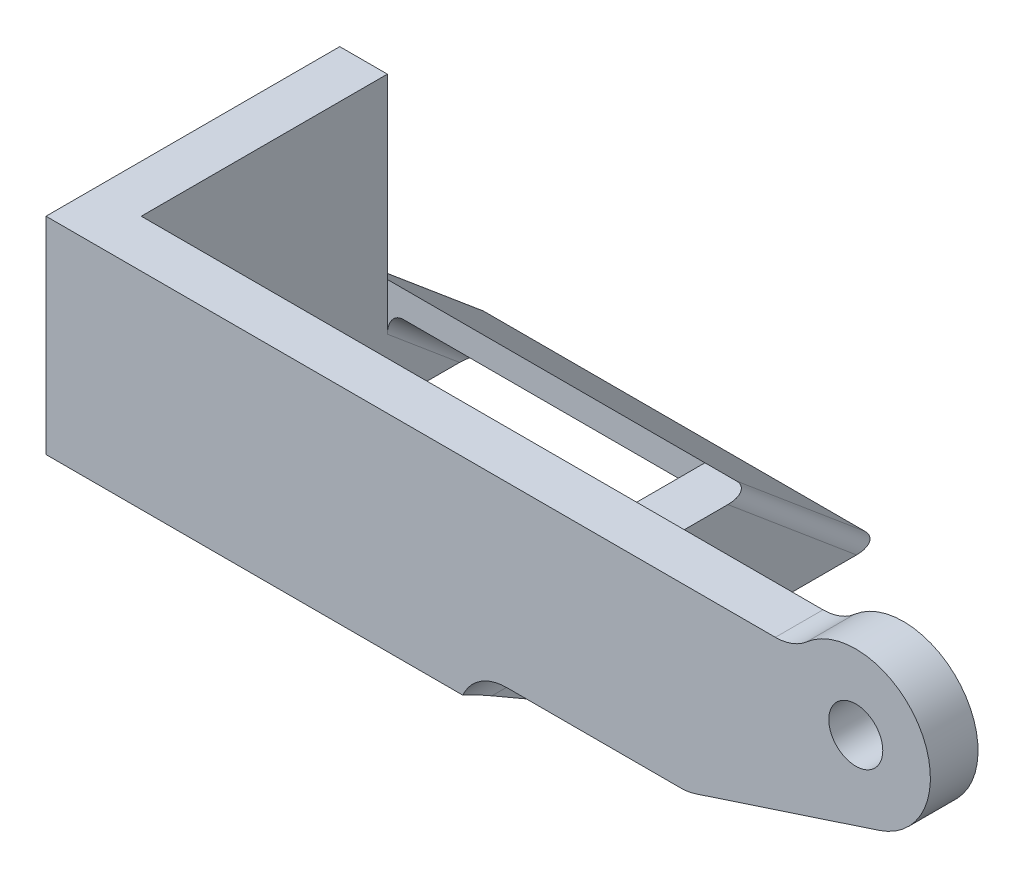
ISO-10303-21;
HEADER;
FILE_DESCRIPTION(('STEP AP214'),'2;1');
FILE_NAME('part.step','',(''),(''),'','','');
FILE_SCHEMA(('AUTOMOTIVE_DESIGN { 1 0 10303 214 1 1 1 1 }'));
ENDSEC;
DATA;
#1=APPLICATION_CONTEXT('core data for automotive mechanical design processes');
#2=APPLICATION_PROTOCOL_DEFINITION('international standard','automotive_design',2000,#1);
#3=PRODUCT_CONTEXT('',#1,'mechanical');
#4=PRODUCT('Part','Part','',(#3));
#5=PRODUCT_RELATED_PRODUCT_CATEGORY('part','',(#4));
#6=PRODUCT_DEFINITION_FORMATION('','',#4);
#7=PRODUCT_DEFINITION_CONTEXT('part definition',#1,'design');
#8=PRODUCT_DEFINITION('design','',#6,#7);
#9=PRODUCT_DEFINITION_SHAPE('','',#8);
#10=(LENGTH_UNIT() NAMED_UNIT(*) SI_UNIT(.MILLI.,.METRE.));
#11=(NAMED_UNIT(*) PLANE_ANGLE_UNIT() SI_UNIT($,.RADIAN.));
#12=(NAMED_UNIT(*) SI_UNIT($,.STERADIAN.) SOLID_ANGLE_UNIT());
#13=UNCERTAINTY_MEASURE_WITH_UNIT(LENGTH_MEASURE(1.E-05),#10,'distance_accuracy_value','');
#14=(GEOMETRIC_REPRESENTATION_CONTEXT(3) GLOBAL_UNCERTAINTY_ASSIGNED_CONTEXT((#13)) GLOBAL_UNIT_ASSIGNED_CONTEXT((#10,
#11,#12)) REPRESENTATION_CONTEXT('',''));
#15=CARTESIAN_POINT('',(0.,0.,0.));
#16=DIRECTION('',(0.,0.,1.));
#17=DIRECTION('',(1.,0.,0.));
#18=AXIS2_PLACEMENT_3D('',#15,#16,#17);
#19=CARTESIAN_POINT('',(-51.,-15.2,-15.5));
#20=DIRECTION('',(0.,0.,1.));
#21=DIRECTION('',(1.,0.,0.));
#22=AXIS2_PLACEMENT_3D('',#19,#20,#21);
#23=PLANE('',#22);
#24=DIRECTION('',(0.,-1.,0.));
#25=VECTOR('',#24,1.);
#26=CARTESIAN_POINT('',(-48.,-15.2,-15.5));
#27=LINE('',#26,#25);
#28=CARTESIAN_POINT('',(-48.,2.79999999999999,-15.5));
#29=VERTEX_POINT('',#28);
#30=CARTESIAN_POINT('',(-48.,-8.4,-15.5));
#31=VERTEX_POINT('',#30);
#32=EDGE_CURVE('E237',#29,#31,#27,.T.);
#33=ORIENTED_EDGE('',*,*,#32,.T.);
#34=DIRECTION('',(1.,0.,0.));
#35=VECTOR('',#34,1.);
#36=CARTESIAN_POINT('',(-61.5789220226508,-8.4,-15.5));
#37=LINE('',#36,#35);
#38=CARTESIAN_POINT('',(-50.,-8.4,-15.5));
#39=VERTEX_POINT('',#38);
#40=EDGE_CURVE('E209',#39,#31,#37,.T.);
#41=ORIENTED_EDGE('',*,*,#40,.F.);
#42=CARTESIAN_POINT('',(-50.,-9.70540728933228,-15.5));
#43=DIRECTION('',(0.,0.,1.));
#44=DIRECTION('',(0.,1.,0.));
#45=AXIS2_PLACEMENT_3D('',#42,#43,#44);
#46=ELLIPSE('',#45,1.30540728933228,1.);
#47=CARTESIAN_POINT('',(-51.,-9.70540728933229,-15.5));
#48=VERTEX_POINT('',#47);
#49=EDGE_CURVE('E371',#39,#48,#46,.T.);
#50=ORIENTED_EDGE('',*,*,#49,.T.);
#51=DIRECTION('',(0.,-1.,0.));
#52=VECTOR('',#51,1.);
#53=CARTESIAN_POINT('',(-51.,-15.2,-15.5));
#54=LINE('',#53,#52);
#55=CARTESIAN_POINT('',(-51.,2.79999999999999,-15.5));
#56=VERTEX_POINT('',#55);
#57=EDGE_CURVE('E264',#56,#48,#54,.T.);
#58=ORIENTED_EDGE('',*,*,#57,.F.);
#59=DIRECTION('',(1.,0.,0.));
#60=VECTOR('',#59,1.);
#61=CARTESIAN_POINT('',(-51.,2.79999999999999,-15.5));
#62=LINE('',#61,#60);
#63=EDGE_CURVE('E245',#56,#29,#62,.T.);
#64=ORIENTED_EDGE('',*,*,#63,.T.);
#65=EDGE_LOOP('',(#33,#41,#50,#58,#64));
#66=FACE_BOUND('',#65,.T.);
#67=ADVANCED_FACE('F35',(#66),#23,.F.);
#68=CARTESIAN_POINT('',(-28.,-8.4,3.));
#69=DIRECTION('',(0.,1.,0.));
#70=DIRECTION('',(0.,0.,1.));
#71=AXIS2_PLACEMENT_3D('',#68,#69,#70);
#72=PLANE('',#71);
#73=DIRECTION('',(1.,0.,0.));
#74=VECTOR('',#73,1.);
#75=CARTESIAN_POINT('',(-28.,-8.4,0.));
#76=LINE('',#75,#74);
#77=CARTESIAN_POINT('',(-22.,-8.4,0.));
#78=VERTEX_POINT('',#77);
#79=CARTESIAN_POINT('',(-11.0286410728593,-8.4,0.));
#80=VERTEX_POINT('',#79);
#81=EDGE_CURVE('E539',#78,#80,#76,.T.);
#82=ORIENTED_EDGE('',*,*,#81,.T.);
#83=DIRECTION('',(0.,0.,-1.));
#84=VECTOR('',#83,1.);
#85=CARTESIAN_POINT('',(-11.0286410728593,-8.4,3.));
#86=LINE('',#85,#84);
#87=CARTESIAN_POINT('',(-11.0286410728593,-8.4,3.));
#88=VERTEX_POINT('',#87);
#89=EDGE_CURVE('E311',#80,#88,#86,.F.);
#90=ORIENTED_EDGE('',*,*,#89,.T.);
#91=DIRECTION('',(1.,0.,0.));
#92=VECTOR('',#91,1.);
#93=CARTESIAN_POINT('',(-28.,-8.4,3.));
#94=LINE('',#93,#92);
#95=CARTESIAN_POINT('',(-22.,-8.4,3.));
#96=VERTEX_POINT('',#95);
#97=EDGE_CURVE('E275',#96,#88,#94,.T.);
#98=ORIENTED_EDGE('',*,*,#97,.F.);
#99=DIRECTION('',(0.,0.,1.));
#100=VECTOR('',#99,1.);
#101=CARTESIAN_POINT('',(-22.,-8.4,0.));
#102=LINE('',#101,#100);
#103=EDGE_CURVE('E309',#96,#78,#102,.F.);
#104=ORIENTED_EDGE('',*,*,#103,.T.);
#105=EDGE_LOOP('',(#82,#90,#98,#104));
#106=FACE_BOUND('',#105,.T.);
#107=ADVANCED_FACE('F424',(#106),#72,.F.);
#108=CARTESIAN_POINT('',(-48.,0.,0.));
#109=DIRECTION('',(1.,0.,0.));
#110=DIRECTION('',(0.,0.,-1.));
#111=AXIS2_PLACEMENT_3D('',#108,#109,#110);
#112=PLANE('',#111);
#113=DIRECTION('',(0.,0.,1.));
#114=VECTOR('',#113,1.);
#115=CARTESIAN_POINT('',(-48.,-15.2,-5.66025403784443));
#116=LINE('',#115,#114);
#117=CARTESIAN_POINT('',(-48.,-15.2,-20.0482006027801));
#118=VERTEX_POINT('',#117);
#119=CARTESIAN_POINT('',(-48.,-15.2,-16.6611914974364));
#120=VERTEX_POINT('',#119);
#121=EDGE_CURVE('E246',#118,#120,#116,.T.);
#122=ORIENTED_EDGE('',*,*,#121,.F.);
#123=DIRECTION('',(0.,0.642787609686543,0.766044443118975));
#124=VECTOR('',#123,1.);
#125=CARTESIAN_POINT('',(-48.,-10.8442437054736,-14.8572123903135));
#126=LINE('',#125,#124);
#127=CARTESIAN_POINT('',(-48.,-11.3836065516869,-15.5));
#128=VERTEX_POINT('',#127);
#129=EDGE_CURVE('E239',#118,#128,#126,.T.);
#130=ORIENTED_EDGE('',*,*,#129,.T.);
#131=DIRECTION('',(0.,-1.,0.));
#132=VECTOR('',#131,1.);
#133=CARTESIAN_POINT('',(-48.,0.,-15.5));
#134=LINE('',#133,#132);
#135=EDGE_CURVE('E221',#31,#128,#134,.T.);
#136=ORIENTED_EDGE('',*,*,#135,.F.);
#137=ORIENTED_EDGE('',*,*,#32,.F.);
#138=DIRECTION('',(0.,0.,-1.));
#139=VECTOR('',#138,1.);
#140=CARTESIAN_POINT('',(-48.,2.79999999999999,-15.5));
#141=LINE('',#140,#139);
#142=CARTESIAN_POINT('',(-48.,2.8,0.));
#143=VERTEX_POINT('',#142);
#144=EDGE_CURVE('E250',#143,#29,#141,.T.);
#145=ORIENTED_EDGE('',*,*,#144,.F.);
#146=DIRECTION('',(0.,-1.,0.));
#147=VECTOR('',#146,1.);
#148=CARTESIAN_POINT('',(-48.,2.79999999999999,0.));
#149=LINE('',#148,#147);
#150=CARTESIAN_POINT('',(-48.,-9.13582222752409,0.));
#151=VERTEX_POINT('',#150);
#152=EDGE_CURVE('E269',#143,#151,#149,.T.);
#153=ORIENTED_EDGE('',*,*,#152,.T.);
#154=DIRECTION('',(0.,0.342020143325666,0.93969262078591));
#155=VECTOR('',#154,1.);
#156=CARTESIAN_POINT('',(-48.,-8.0671340391209,2.93619666607566));
#157=LINE('',#156,#155);
#158=EDGE_CURVE('E347',#151,#120,#157,.F.);
#159=ORIENTED_EDGE('',*,*,#158,.T.);
#160=EDGE_LOOP('',(#122,#130,#136,#137,#145,#153,#159));
#161=FACE_BOUND('',#160,.T.);
#162=ADVANCED_FACE('F235',(#161),#112,.T.);
#163=CARTESIAN_POINT('',(0.,0.,3.));
#164=DIRECTION('',(0.,0.,-1.));
#165=DIRECTION('',(-1.,0.,0.));
#166=AXIS2_PLACEMENT_3D('',#163,#164,#165);
#167=PLANE('',#166);
#168=ORIENTED_EDGE('',*,*,#97,.T.);
#169=CARTESIAN_POINT('',(-11.0286410728593,-5.4,3.));
#170=DIRECTION('',(0.,0.,-1.));
#171=DIRECTION('',(-1.,0.,0.));
#172=AXIS2_PLACEMENT_3D('',#169,#170,#171);
#173=CIRCLE('',#172,3.);
#174=CARTESIAN_POINT('',(-10.0951004102036,-8.25105275839792,3.));
#175=VERTEX_POINT('',#174);
#176=EDGE_CURVE('E313',#88,#175,#173,.F.);
#177=ORIENTED_EDGE('',*,*,#176,.T.);
#178=DIRECTION('',(0.950350919465973,0.311180220885228,0.));
#179=VECTOR('',#178,1.);
#180=CARTESIAN_POINT('',(-10.5499884092088,-8.4,3.));
#181=LINE('',#180,#179);
#182=CARTESIAN_POINT('',(1.46254703816057,-4.46664932149007,3.));
#183=VERTEX_POINT('',#182);
#184=EDGE_CURVE('E279',#175,#183,#181,.T.);
#185=ORIENTED_EDGE('',*,*,#184,.T.);
#186=CARTESIAN_POINT('',(0.,0.,3.));
#187=DIRECTION('',(0.,0.,1.));
#188=DIRECTION('',(-1.,0.,0.));
#189=AXIS2_PLACEMENT_3D('',#186,#187,#188);
#190=CIRCLE('',#189,4.7);
#191=CARTESIAN_POINT('',(-3.09136878607132,3.54025974025974,3.));
#192=VERTEX_POINT('',#191);
#193=EDGE_CURVE('E281',#183,#192,#190,.T.);
#194=ORIENTED_EDGE('',*,*,#193,.T.);
#195=CARTESIAN_POINT('',(-5.06458290484024,5.8,3.));
#196=DIRECTION('',(0.,0.,-1.));
#197=DIRECTION('',(-1.,0.,0.));
#198=AXIS2_PLACEMENT_3D('',#195,#196,#197);
#199=CIRCLE('',#198,3.);
#200=CARTESIAN_POINT('',(-5.06458290484024,2.8,3.));
#201=VERTEX_POINT('',#200);
#202=EDGE_CURVE('E320',#192,#201,#199,.T.);
#203=ORIENTED_EDGE('',*,*,#202,.T.);
#204=DIRECTION('',(-1.,0.,0.));
#205=VECTOR('',#204,1.);
#206=CARTESIAN_POINT('',(-3.77491721763538,2.8,3.));
#207=LINE('',#206,#205);
#208=CARTESIAN_POINT('',(-51.,2.8,3.));
#209=VERTEX_POINT('',#208);
#210=EDGE_CURVE('E284',#201,#209,#207,.T.);
#211=ORIENTED_EDGE('',*,*,#210,.T.);
#212=DIRECTION('',(0.,1.,0.));
#213=VECTOR('',#212,1.);
#214=CARTESIAN_POINT('',(-51.,2.8,3.));
#215=LINE('',#214,#213);
#216=CARTESIAN_POINT('',(-51.,-10.2,3.));
#217=VERTEX_POINT('',#216);
#218=EDGE_CURVE('E481',#217,#209,#215,.T.);
#219=ORIENTED_EDGE('',*,*,#218,.F.);
#220=DIRECTION('',(1.,0.,0.));
#221=VECTOR('',#220,1.);
#222=CARTESIAN_POINT('',(-48.,-10.2,3.));
#223=LINE('',#222,#221);
#224=CARTESIAN_POINT('',(-24.7495454169735,-10.2,3.));
#225=VERTEX_POINT('',#224);
#226=EDGE_CURVE('E273',#217,#225,#223,.T.);
#227=ORIENTED_EDGE('',*,*,#226,.T.);
#228=CARTESIAN_POINT('',(-22.,-11.4,3.));
#229=DIRECTION('',(0.,0.,-1.));
#230=DIRECTION('',(-1.,0.,0.));
#231=AXIS2_PLACEMENT_3D('',#228,#229,#230);
#232=CIRCLE('',#231,3.);
#233=EDGE_CURVE('E325',#225,#96,#232,.T.);
#234=ORIENTED_EDGE('',*,*,#233,.T.);
#235=EDGE_LOOP('',(#168,#177,#185,#194,#203,#211,#219,#227,#234));
#236=FACE_BOUND('',#235,.T.);
#237=CARTESIAN_POINT('',(0.,0.,3.));
#238=DIRECTION('',(0.,0.,1.));
#239=DIRECTION('',(1.,0.,0.));
#240=AXIS2_PLACEMENT_3D('',#237,#238,#239);
#241=CIRCLE('',#240,1.7);
#242=CARTESIAN_POINT('',(1.7,0.,3.));
#243=VERTEX_POINT('',#242);
#244=EDGE_CURVE('E266',#243,#243,#241,.T.);
#245=ORIENTED_EDGE('',*,*,#244,.F.);
#246=EDGE_LOOP('',(#245));
#247=FACE_BOUND('',#246,.T.);
#248=ADVANCED_FACE('F440',(#236,#247),#167,.F.);
#249=CARTESIAN_POINT('',(0.,0.,0.));
#250=DIRECTION('',(0.,0.,-1.));
#251=DIRECTION('',(-1.,0.,0.));
#252=AXIS2_PLACEMENT_3D('',#249,#250,#251);
#253=PLANE('',#252);
#254=DIRECTION('',(1.,0.,0.));
#255=VECTOR('',#254,1.);
#256=CARTESIAN_POINT('',(-48.,-10.2,0.));
#257=LINE('',#256,#255);
#258=CARTESIAN_POINT('',(-47.,-10.2,0.));
#259=VERTEX_POINT('',#258);
#260=CARTESIAN_POINT('',(-29.,-10.2,0.));
#261=VERTEX_POINT('',#260);
#262=EDGE_CURVE('E289',#259,#261,#257,.T.);
#263=ORIENTED_EDGE('',*,*,#262,.F.);
#264=CARTESIAN_POINT('',(-47.,-9.13582222752409,0.));
#265=DIRECTION('',(0.,0.,-1.));
#266=DIRECTION('',(0.,1.,0.));
#267=AXIS2_PLACEMENT_3D('',#264,#265,#266);
#268=ELLIPSE('',#267,1.06417777247591,1.);
#269=EDGE_CURVE('E369',#259,#151,#268,.T.);
#270=ORIENTED_EDGE('',*,*,#269,.T.);
#271=ORIENTED_EDGE('',*,*,#152,.F.);
#272=DIRECTION('',(-1.,0.,0.));
#273=VECTOR('',#272,1.);
#274=CARTESIAN_POINT('',(-3.77491721763538,2.8,0.));
#275=LINE('',#274,#273);
#276=CARTESIAN_POINT('',(-5.06458290484024,2.8,0.));
#277=VERTEX_POINT('',#276);
#278=EDGE_CURVE('E276',#277,#143,#275,.T.);
#279=ORIENTED_EDGE('',*,*,#278,.F.);
#280=CARTESIAN_POINT('',(-5.06458290484024,5.8,0.));
#281=DIRECTION('',(0.,0.,-1.));
#282=DIRECTION('',(-1.,0.,0.));
#283=AXIS2_PLACEMENT_3D('',#280,#281,#282);
#284=CIRCLE('',#283,3.);
#285=CARTESIAN_POINT('',(-3.09136878607132,3.54025974025974,0.));
#286=VERTEX_POINT('',#285);
#287=EDGE_CURVE('E318',#277,#286,#284,.F.);
#288=ORIENTED_EDGE('',*,*,#287,.T.);
#289=CARTESIAN_POINT('',(0.,0.,0.));
#290=DIRECTION('',(0.,0.,1.));
#291=DIRECTION('',(-1.,0.,0.));
#292=AXIS2_PLACEMENT_3D('',#289,#290,#291);
#293=CIRCLE('',#292,4.7);
#294=CARTESIAN_POINT('',(1.46254703816057,-4.46664932149007,0.));
#295=VERTEX_POINT('',#294);
#296=EDGE_CURVE('E298',#295,#286,#293,.T.);
#297=ORIENTED_EDGE('',*,*,#296,.F.);
#298=DIRECTION('',(0.950350919465973,0.311180220885228,0.));
#299=VECTOR('',#298,1.);
#300=CARTESIAN_POINT('',(-10.5499884092088,-8.4,0.));
#301=LINE('',#300,#299);
#302=CARTESIAN_POINT('',(-10.0951004102036,-8.25105275839792,0.));
#303=VERTEX_POINT('',#302);
#304=EDGE_CURVE('E543',#303,#295,#301,.T.);
#305=ORIENTED_EDGE('',*,*,#304,.F.);
#306=CARTESIAN_POINT('',(-11.0286410728593,-5.4,0.));
#307=DIRECTION('',(0.,0.,-1.));
#308=DIRECTION('',(-1.,0.,0.));
#309=AXIS2_PLACEMENT_3D('',#306,#307,#308);
#310=CIRCLE('',#309,3.);
#311=EDGE_CURVE('E307',#303,#80,#310,.T.);
#312=ORIENTED_EDGE('',*,*,#311,.T.);
#313=ORIENTED_EDGE('',*,*,#81,.F.);
#314=CARTESIAN_POINT('',(-22.,-11.4,0.));
#315=DIRECTION('',(0.,0.,-1.));
#316=DIRECTION('',(-1.,0.,0.));
#317=AXIS2_PLACEMENT_3D('',#314,#315,#316);
#318=CIRCLE('',#317,3.);
#319=CARTESIAN_POINT('',(-24.,-9.16393202250021,0.));
#320=VERTEX_POINT('',#319);
#321=EDGE_CURVE('E327',#78,#320,#318,.F.);
#322=ORIENTED_EDGE('',*,*,#321,.T.);
#323=DIRECTION('',(0.,-1.,0.));
#324=VECTOR('',#323,1.);
#325=CARTESIAN_POINT('',(-24.,0.,0.));
#326=LINE('',#325,#324);
#327=CARTESIAN_POINT('',(-24.,-8.4,0.));
#328=VERTEX_POINT('',#327);
#329=EDGE_CURVE('E365',#320,#328,#326,.F.);
#330=ORIENTED_EDGE('',*,*,#329,.T.);
#331=CARTESIAN_POINT('',(-28.,-8.4,0.));
#332=VERTEX_POINT('',#331);
#333=EDGE_CURVE('E50',#332,#328,#76,.T.);
#334=ORIENTED_EDGE('',*,*,#333,.F.);
#335=DIRECTION('',(0.,1.,0.));
#336=VECTOR('',#335,1.);
#337=CARTESIAN_POINT('',(-28.,-10.2,0.));
#338=LINE('',#337,#336);
#339=CARTESIAN_POINT('',(-28.,-9.13582222752409,0.));
#340=VERTEX_POINT('',#339);
#341=EDGE_CURVE('E541',#340,#332,#338,.T.);
#342=ORIENTED_EDGE('',*,*,#341,.F.);
#343=CARTESIAN_POINT('',(-29.,-9.13582222752409,0.));
#344=DIRECTION('',(0.,0.,-1.));
#345=DIRECTION('',(0.,-1.,0.));
#346=AXIS2_PLACEMENT_3D('',#343,#344,#345);
#347=ELLIPSE('',#346,1.06417777247591,1.);
#348=EDGE_CURVE('E367',#340,#261,#347,.T.);
#349=ORIENTED_EDGE('',*,*,#348,.T.);
#350=EDGE_LOOP('',(#263,#270,#271,#279,#288,#297,#305,#312,#313,#322,#330,#334,#342,#349));
#351=FACE_BOUND('',#350,.T.);
#352=CARTESIAN_POINT('',(0.,0.,0.));
#353=DIRECTION('',(0.,0.,1.));
#354=DIRECTION('',(1.,0.,0.));
#355=AXIS2_PLACEMENT_3D('',#352,#353,#354);
#356=CIRCLE('',#355,1.7);
#357=CARTESIAN_POINT('',(1.7,0.,0.));
#358=VERTEX_POINT('',#357);
#359=EDGE_CURVE('E270',#358,#358,#356,.T.);
#360=ORIENTED_EDGE('',*,*,#359,.T.);
#361=EDGE_LOOP('',(#360));
#362=FACE_BOUND('',#361,.T.);
#363=ADVANCED_FACE('F443',(#351,#362),#253,.T.);
#364=CARTESIAN_POINT('',(-10.5499884092088,-8.4,3.));
#365=DIRECTION('',(-0.311180220885228,0.950350919465973,0.));
#366=DIRECTION('',(-0.950350919465973,-0.311180220885228,0.));
#367=AXIS2_PLACEMENT_3D('',#364,#365,#366);
#368=PLANE('',#367);
#369=ORIENTED_EDGE('',*,*,#184,.F.);
#370=DIRECTION('',(0.,0.,-1.));
#371=VECTOR('',#370,1.);
#372=CARTESIAN_POINT('',(-10.0951004102036,-8.25105275839792,3.));
#373=LINE('',#372,#371);
#374=EDGE_CURVE('E304',#175,#303,#373,.T.);
#375=ORIENTED_EDGE('',*,*,#374,.T.);
#376=ORIENTED_EDGE('',*,*,#304,.T.);
#377=DIRECTION('',(0.,0.,-1.));
#378=VECTOR('',#377,1.);
#379=CARTESIAN_POINT('',(1.46254703816057,-4.46664932149007,3.));
#380=LINE('',#379,#378);
#381=EDGE_CURVE('E286',#183,#295,#380,.T.);
#382=ORIENTED_EDGE('',*,*,#381,.F.);
#383=EDGE_LOOP('',(#369,#375,#376,#382));
#384=FACE_BOUND('',#383,.T.);
#385=ADVANCED_FACE('F447',(#384),#368,.F.);
#386=CARTESIAN_POINT('',(0.,0.,3.));
#387=DIRECTION('',(0.,0.,-1.));
#388=DIRECTION('',(-1.,0.,0.));
#389=AXIS2_PLACEMENT_3D('',#386,#387,#388);
#390=CYLINDRICAL_SURFACE('',#389,4.7);
#391=ORIENTED_EDGE('',*,*,#296,.T.);
#392=DIRECTION('',(0.,0.,-1.));
#393=VECTOR('',#392,1.);
#394=CARTESIAN_POINT('',(-3.09136878607132,3.54025974025974,3.));
#395=LINE('',#394,#393);
#396=EDGE_CURVE('E302',#286,#192,#395,.F.);
#397=ORIENTED_EDGE('',*,*,#396,.T.);
#398=ORIENTED_EDGE('',*,*,#193,.F.);
#399=ORIENTED_EDGE('',*,*,#381,.T.);
#400=EDGE_LOOP('',(#391,#397,#398,#399));
#401=FACE_BOUND('',#400,.T.);
#402=ADVANCED_FACE('F451',(#401),#390,.T.);
#403=CARTESIAN_POINT('',(-3.77491721763538,2.8,3.));
#404=DIRECTION('',(0.,-1.,0.));
#405=DIRECTION('',(1.,0.,0.));
#406=AXIS2_PLACEMENT_3D('',#403,#404,#405);
#407=PLANE('',#406);
#408=ORIENTED_EDGE('',*,*,#210,.F.);
#409=DIRECTION('',(0.,0.,1.));
#410=VECTOR('',#409,1.);
#411=CARTESIAN_POINT('',(-5.06458290484024,2.8,0.));
#412=LINE('',#411,#410);
#413=EDGE_CURVE('E299',#201,#277,#412,.F.);
#414=ORIENTED_EDGE('',*,*,#413,.T.);
#415=ORIENTED_EDGE('',*,*,#278,.T.);
#416=ORIENTED_EDGE('',*,*,#144,.T.);
#417=ORIENTED_EDGE('',*,*,#63,.F.);
#418=DIRECTION('',(0.,0.,-1.));
#419=VECTOR('',#418,1.);
#420=CARTESIAN_POINT('',(-51.,2.79999999999999,-15.5));
#421=LINE('',#420,#419);
#422=EDGE_CURVE('E256',#209,#56,#421,.T.);
#423=ORIENTED_EDGE('',*,*,#422,.F.);
#424=EDGE_LOOP('',(#408,#414,#415,#416,#417,#423));
#425=FACE_BOUND('',#424,.T.);
#426=ADVANCED_FACE('F438',(#425),#407,.F.);
#427=CARTESIAN_POINT('',(0.,0.,3.));
#428=DIRECTION('',(0.,0.,-1.));
#429=DIRECTION('',(-1.,0.,0.));
#430=AXIS2_PLACEMENT_3D('',#427,#428,#429);
#431=CYLINDRICAL_SURFACE('',#430,1.7);
#432=ORIENTED_EDGE('',*,*,#244,.T.);
#433=EDGE_LOOP('',(#432));
#434=FACE_BOUND('',#433,.T.);
#435=ORIENTED_EDGE('',*,*,#359,.F.);
#436=EDGE_LOOP('',(#435));
#437=FACE_BOUND('',#436,.T.);
#438=ADVANCED_FACE('F435',(#434,#437),#431,.F.);
#439=CARTESIAN_POINT('',(-51.,-15.2,-5.66025403784443));
#440=DIRECTION('',(0.,1.,0.));
#441=DIRECTION('',(0.,0.,1.));
#442=AXIS2_PLACEMENT_3D('',#439,#440,#441);
#443=PLANE('',#442);
#444=DIRECTION('',(1.,0.,0.));
#445=VECTOR('',#444,1.);
#446=CARTESIAN_POINT('',(-61.5789220226508,-15.2,-21.6039244296405));
#447=LINE('',#446,#445);
#448=CARTESIAN_POINT('',(-47.,-15.2,-21.6039244296405));
#449=VERTEX_POINT('',#448);
#450=CARTESIAN_POINT('',(-29.,-15.2,-21.6039244296405));
#451=VERTEX_POINT('',#450);
#452=EDGE_CURVE('E506',#449,#451,#447,.T.);
#453=ORIENTED_EDGE('',*,*,#452,.F.);
#454=CARTESIAN_POINT('',(-47.,-15.2,-20.0482006027801));
#455=DIRECTION('',(0.,1.,0.));
#456=DIRECTION('',(0.,0.,-1.));
#457=AXIS2_PLACEMENT_3D('',#454,#455,#456);
#458=ELLIPSE('',#457,1.5557238268604,1.);
#459=EDGE_CURVE('E375',#449,#118,#458,.T.);
#460=ORIENTED_EDGE('',*,*,#459,.T.);
#461=ORIENTED_EDGE('',*,*,#121,.T.);
#462=CARTESIAN_POINT('',(-47.,-15.2,-16.6611914974364));
#463=DIRECTION('',(0.,1.,0.));
#464=DIRECTION('',(0.,0.,1.));
#465=AXIS2_PLACEMENT_3D('',#462,#463,#464);
#466=ELLIPSE('',#465,2.92380440016311,1.);
#467=CARTESIAN_POINT('',(-47.,-15.2,-13.7373870972732));
#468=VERTEX_POINT('',#467);
#469=EDGE_CURVE('E381',#120,#468,#466,.T.);
#470=ORIENTED_EDGE('',*,*,#469,.T.);
#471=DIRECTION('',(-1.,0.,0.));
#472=VECTOR('',#471,1.);
#473=CARTESIAN_POINT('',(-10.5317394442386,-15.2,-13.7373870972732));
#474=LINE('',#473,#472);
#475=CARTESIAN_POINT('',(-29.,-15.2,-13.7373870972732));
#476=VERTEX_POINT('',#475);
#477=EDGE_CURVE('E247',#476,#468,#474,.T.);
#478=ORIENTED_EDGE('',*,*,#477,.F.);
#479=CARTESIAN_POINT('',(-29.,-15.2,-16.6611914974364));
#480=DIRECTION('',(0.,1.,0.));
#481=DIRECTION('',(0.,0.,-1.));
#482=AXIS2_PLACEMENT_3D('',#479,#480,#481);
#483=ELLIPSE('',#482,2.92380440016311,1.);
#484=CARTESIAN_POINT('',(-28.,-15.2,-16.6611914974364));
#485=VERTEX_POINT('',#484);
#486=EDGE_CURVE('E383',#476,#485,#483,.T.);
#487=ORIENTED_EDGE('',*,*,#486,.T.);
#488=DIRECTION('',(0.,0.,-1.));
#489=VECTOR('',#488,1.);
#490=CARTESIAN_POINT('',(-28.,-15.2,-15.5));
#491=LINE('',#490,#489);
#492=CARTESIAN_POINT('',(-28.,-15.2,-20.0482006027801));
#493=VERTEX_POINT('',#492);
#494=EDGE_CURVE('E493',#485,#493,#491,.T.);
#495=ORIENTED_EDGE('',*,*,#494,.T.);
#496=CARTESIAN_POINT('',(-29.,-15.2,-20.0482006027801));
#497=DIRECTION('',(0.,1.,0.));
#498=DIRECTION('',(0.,0.,-1.));
#499=AXIS2_PLACEMENT_3D('',#496,#497,#498);
#500=ELLIPSE('',#499,1.5557238268604,1.);
#501=EDGE_CURVE('E379',#493,#451,#500,.T.);
#502=ORIENTED_EDGE('',*,*,#501,.T.);
#503=EDGE_LOOP('',(#453,#460,#461,#470,#478,#487,#495,#502));
#504=FACE_BOUND('',#503,.T.);
#505=DIRECTION('',(0.,0.,1.));
#506=VECTOR('',#505,1.);
#507=CARTESIAN_POINT('',(-51.,-15.2,-5.66025403784443));
#508=LINE('',#507,#506);
#509=CARTESIAN_POINT('',(-51.,-15.2,-22.0482006027801));
#510=VERTEX_POINT('',#509);
#511=CARTESIAN_POINT('',(-51.,-15.2,-5.66025403784443));
#512=VERTEX_POINT('',#511);
#513=EDGE_CURVE('E484',#510,#512,#508,.T.);
#514=ORIENTED_EDGE('',*,*,#513,.F.);
#515=CARTESIAN_POINT('',(-50.,-15.2,-22.0482006027801));
#516=DIRECTION('',(0.,1.,0.));
#517=DIRECTION('',(0.,0.,1.));
#518=AXIS2_PLACEMENT_3D('',#515,#516,#517);
#519=ELLIPSE('',#518,1.5557238268604,1.);
#520=CARTESIAN_POINT('',(-50.,-15.2,-23.6039244296405));
#521=VERTEX_POINT('',#520);
#522=EDGE_CURVE('E334',#510,#521,#519,.F.);
#523=ORIENTED_EDGE('',*,*,#522,.T.);
#524=DIRECTION('',(1.,0.,0.));
#525=VECTOR('',#524,1.);
#526=CARTESIAN_POINT('',(-61.5789220226508,-15.2,-23.6039244296405));
#527=LINE('',#526,#525);
#528=CARTESIAN_POINT('',(-26.,-15.2,-23.6039244296405));
#529=VERTEX_POINT('',#528);
#530=EDGE_CURVE('E230',#521,#529,#527,.T.);
#531=ORIENTED_EDGE('',*,*,#530,.T.);
#532=CARTESIAN_POINT('',(-26.,-15.2,-22.0482006027801));
#533=DIRECTION('',(0.,1.,0.));
#534=DIRECTION('',(0.,0.,-1.));
#535=AXIS2_PLACEMENT_3D('',#532,#533,#534);
#536=ELLIPSE('',#535,1.5557238268604,1.);
#537=CARTESIAN_POINT('',(-25.,-15.2,-22.0482006027801));
#538=VERTEX_POINT('',#537);
#539=EDGE_CURVE('E332',#529,#538,#536,.F.);
#540=ORIENTED_EDGE('',*,*,#539,.T.);
#541=DIRECTION('',(0.,0.,-1.));
#542=VECTOR('',#541,1.);
#543=CARTESIAN_POINT('',(-25.,-15.2,-15.5));
#544=LINE('',#543,#542);
#545=CARTESIAN_POINT('',(-25.,-15.2,-5.66025403784443));
#546=VERTEX_POINT('',#545);
#547=EDGE_CURVE('E490',#546,#538,#544,.T.);
#548=ORIENTED_EDGE('',*,*,#547,.F.);
#549=DIRECTION('',(1.,0.,0.));
#550=VECTOR('',#549,1.);
#551=CARTESIAN_POINT('',(-51.,-15.2,-5.66025403784443));
#552=LINE('',#551,#550);
#553=EDGE_CURVE('E265',#512,#546,#552,.T.);
#554=ORIENTED_EDGE('',*,*,#553,.F.);
#555=EDGE_LOOP('',(#514,#523,#531,#540,#548,#554));
#556=FACE_BOUND('',#555,.T.);
#557=ADVANCED_FACE('F433',(#504,#556),#443,.F.);
#558=CARTESIAN_POINT('',(-51.,-10.2,3.));
#559=DIRECTION('',(0.,0.86602540378444,-0.499999999999998));
#560=DIRECTION('',(0.,0.499999999999998,0.86602540378444));
#561=AXIS2_PLACEMENT_3D('',#558,#559,#560);
#562=PLANE('',#561);
#563=ORIENTED_EDGE('',*,*,#553,.T.);
#564=DIRECTION('',(0.,-0.5,-0.866025403784439));
#565=VECTOR('',#564,1.);
#566=CARTESIAN_POINT('',(-25.,-15.2,-5.66025403784443));
#567=LINE('',#566,#565);
#568=CARTESIAN_POINT('',(-25.,-11.4,0.921539030917311));
#569=VERTEX_POINT('',#568);
#570=EDGE_CURVE('E499',#569,#546,#567,.T.);
#571=ORIENTED_EDGE('',*,*,#570,.F.);
#572=CARTESIAN_POINT('',(-22.,-11.4,0.921539030917344));
#573=DIRECTION('',(0.,0.86602540378444,-0.499999999999998));
#574=DIRECTION('',(0.,-0.499999999999998,-0.86602540378444));
#575=AXIS2_PLACEMENT_3D('',#572,#573,#574);
#576=ELLIPSE('',#575,6.00000000000002,3.);
#577=EDGE_CURVE('E322',#569,#225,#576,.T.);
#578=ORIENTED_EDGE('',*,*,#577,.T.);
#579=ORIENTED_EDGE('',*,*,#226,.F.);
#580=DIRECTION('',(0.,0.499999999999998,0.86602540378444));
#581=VECTOR('',#580,1.);
#582=CARTESIAN_POINT('',(-51.,-10.2,3.));
#583=LINE('',#582,#581);
#584=EDGE_CURVE('E482',#512,#217,#583,.T.);
#585=ORIENTED_EDGE('',*,*,#584,.F.);
#586=EDGE_LOOP('',(#563,#571,#578,#579,#585));
#587=FACE_BOUND('',#586,.T.);
#588=ADVANCED_FACE('F525',(#587),#562,.F.);
#589=CARTESIAN_POINT('',(-51.,0.,0.));
#590=DIRECTION('',(1.,0.,0.));
#591=DIRECTION('',(0.,0.,-1.));
#592=AXIS2_PLACEMENT_3D('',#589,#590,#591);
#593=PLANE('',#592);
#594=ORIENTED_EDGE('',*,*,#57,.T.);
#595=DIRECTION('',(0.,-0.642787609686543,-0.766044443118975));
#596=VECTOR('',#595,1.);
#597=CARTESIAN_POINT('',(-51.,-15.966044443119,-22.961136819954));
#598=LINE('',#597,#596);
#599=EDGE_CURVE('E329',#48,#510,#598,.T.);
#600=ORIENTED_EDGE('',*,*,#599,.T.);
#601=ORIENTED_EDGE('',*,*,#513,.T.);
#602=ORIENTED_EDGE('',*,*,#584,.T.);
#603=ORIENTED_EDGE('',*,*,#218,.T.);
#604=ORIENTED_EDGE('',*,*,#422,.T.);
#605=EDGE_LOOP('',(#594,#600,#601,#602,#603,#604));
#606=FACE_BOUND('',#605,.T.);
#607=ADVANCED_FACE('F529',(#606),#593,.F.);
#608=CARTESIAN_POINT('',(-10.5317394442386,-10.2,0.));
#609=DIRECTION('',(0.,-0.93969262078591,0.342020143325666));
#610=DIRECTION('',(0.,-0.342020143325666,-0.93969262078591));
#611=AXIS2_PLACEMENT_3D('',#608,#609,#610);
#612=PLANE('',#611);
#613=ORIENTED_EDGE('',*,*,#477,.T.);
#614=DIRECTION('',(0.,0.342020143325666,0.93969262078591));
#615=VECTOR('',#614,1.);
#616=CARTESIAN_POINT('',(-47.,-10.2,0.));
#617=LINE('',#616,#615);
#618=EDGE_CURVE('E362',#468,#259,#617,.T.);
#619=ORIENTED_EDGE('',*,*,#618,.T.);
#620=ORIENTED_EDGE('',*,*,#262,.T.);
#621=DIRECTION('',(0.,-0.342020143325666,-0.93969262078591));
#622=VECTOR('',#621,1.);
#623=CARTESIAN_POINT('',(-29.,-10.2,0.));
#624=LINE('',#623,#622);
#625=EDGE_CURVE('E359',#261,#476,#624,.T.);
#626=ORIENTED_EDGE('',*,*,#625,.T.);
#627=EDGE_LOOP('',(#613,#619,#620,#626));
#628=FACE_BOUND('',#627,.T.);
#629=ADVANCED_FACE('F559',(#628),#612,.F.);
#630=CARTESIAN_POINT('',(-25.,-8.4,3.));
#631=DIRECTION('',(0.,-1.,0.));
#632=DIRECTION('',(0.,0.,-1.));
#633=AXIS2_PLACEMENT_3D('',#630,#631,#632);
#634=PLANE('',#633);
#635=DIRECTION('',(0.,0.,1.));
#636=VECTOR('',#635,1.);
#637=CARTESIAN_POINT('',(-25.,-8.4,3.));
#638=LINE('',#637,#636);
#639=CARTESIAN_POINT('',(-25.,-8.4,-13.9442761731396));
#640=VERTEX_POINT('',#639);
#641=CARTESIAN_POINT('',(-25.,-8.4,-1.));
#642=VERTEX_POINT('',#641);
#643=EDGE_CURVE('E492',#640,#642,#638,.T.);
#644=ORIENTED_EDGE('',*,*,#643,.F.);
#645=CARTESIAN_POINT('',(-26.,-8.4,-13.9442761731396));
#646=DIRECTION('',(0.,-1.,0.));
#647=DIRECTION('',(0.,0.,-1.));
#648=AXIS2_PLACEMENT_3D('',#645,#646,#647);
#649=ELLIPSE('',#648,1.5557238268604,1.);
#650=CARTESIAN_POINT('',(-26.,-8.4,-15.5));
#651=VERTEX_POINT('',#650);
#652=EDGE_CURVE('E345',#640,#651,#649,.F.);
#653=ORIENTED_EDGE('',*,*,#652,.T.);
#654=DIRECTION('',(-1.,0.,0.));
#655=VECTOR('',#654,1.);
#656=CARTESIAN_POINT('',(-25.,-8.4,-15.5));
#657=LINE('',#656,#655);
#658=CARTESIAN_POINT('',(-28.,-8.4,-15.5));
#659=VERTEX_POINT('',#658);
#660=EDGE_CURVE('E253',#651,#659,#657,.T.);
#661=ORIENTED_EDGE('',*,*,#660,.T.);
#662=DIRECTION('',(0.,0.,1.));
#663=VECTOR('',#662,1.);
#664=CARTESIAN_POINT('',(-28.,-8.4,3.));
#665=LINE('',#664,#663);
#666=EDGE_CURVE('E240',#659,#332,#665,.T.);
#667=ORIENTED_EDGE('',*,*,#666,.T.);
#668=ORIENTED_EDGE('',*,*,#333,.T.);
#669=CARTESIAN_POINT('',(-24.,-8.4,-1.));
#670=DIRECTION('',(0.,-1.,0.));
#671=DIRECTION('',(0.,0.,-1.));
#672=AXIS2_PLACEMENT_3D('',#669,#670,#671);
#673=CIRCLE('',#672,1.);
#674=EDGE_CURVE('E11',#328,#642,#673,.T.);
#675=ORIENTED_EDGE('',*,*,#674,.T.);
#676=EDGE_LOOP('',(#644,#653,#661,#667,#668,#675));
#677=FACE_BOUND('',#676,.T.);
#678=ADVANCED_FACE('F519',(#677),#634,.F.);
#679=CARTESIAN_POINT('',(-25.,0.,0.));
#680=DIRECTION('',(-1.,0.,0.));
#681=DIRECTION('',(0.,0.,1.));
#682=AXIS2_PLACEMENT_3D('',#679,#680,#681);
#683=PLANE('',#682);
#684=ORIENTED_EDGE('',*,*,#547,.T.);
#685=DIRECTION('',(0.,0.642787609686543,0.766044443118975));
#686=VECTOR('',#685,1.);
#687=CARTESIAN_POINT('',(-25.,-9.16604444311898,-14.8572123903135));
#688=LINE('',#687,#686);
#689=EDGE_CURVE('E342',#538,#640,#688,.T.);
#690=ORIENTED_EDGE('',*,*,#689,.T.);
#691=ORIENTED_EDGE('',*,*,#643,.T.);
#692=DIRECTION('',(0.,-1.,0.));
#693=VECTOR('',#692,1.);
#694=CARTESIAN_POINT('',(-25.,0.,-1.));
#695=LINE('',#694,#693);
#696=CARTESIAN_POINT('',(-25.,-11.4,-1.));
#697=VERTEX_POINT('',#696);
#698=EDGE_CURVE('E339',#642,#697,#695,.T.);
#699=ORIENTED_EDGE('',*,*,#698,.T.);
#700=DIRECTION('',(0.,0.,1.));
#701=VECTOR('',#700,1.);
#702=CARTESIAN_POINT('',(-25.,-11.4,3.));
#703=LINE('',#702,#701);
#704=EDGE_CURVE('E315',#697,#569,#703,.T.);
#705=ORIENTED_EDGE('',*,*,#704,.T.);
#706=ORIENTED_EDGE('',*,*,#570,.T.);
#707=EDGE_LOOP('',(#684,#690,#691,#699,#705,#706));
#708=FACE_BOUND('',#707,.T.);
#709=ADVANCED_FACE('F467',(#708),#683,.F.);
#710=CARTESIAN_POINT('',(-28.,0.,0.));
#711=DIRECTION('',(-1.,0.,0.));
#712=DIRECTION('',(0.,0.,1.));
#713=AXIS2_PLACEMENT_3D('',#710,#711,#712);
#714=PLANE('',#713);
#715=DIRECTION('',(0.,1.,0.));
#716=VECTOR('',#715,1.);
#717=CARTESIAN_POINT('',(-28.,-8.4,-15.5));
#718=LINE('',#717,#716);
#719=CARTESIAN_POINT('',(-28.,-11.3836065516869,-15.5));
#720=VERTEX_POINT('',#719);
#721=EDGE_CURVE('E229',#720,#659,#718,.T.);
#722=ORIENTED_EDGE('',*,*,#721,.F.);
#723=DIRECTION('',(0.,0.642787609686543,0.766044443118975));
#724=VECTOR('',#723,1.);
#725=CARTESIAN_POINT('',(-28.,-15.966044443119,-20.961136819954));
#726=LINE('',#725,#724);
#727=EDGE_CURVE('E357',#720,#493,#726,.F.);
#728=ORIENTED_EDGE('',*,*,#727,.T.);
#729=ORIENTED_EDGE('',*,*,#494,.F.);
#730=DIRECTION('',(0.,-0.342020143325666,-0.93969262078591));
#731=VECTOR('',#730,1.);
#732=CARTESIAN_POINT('',(-28.,-8.0671340391209,2.93619666607566));
#733=LINE('',#732,#731);
#734=EDGE_CURVE('E355',#485,#340,#733,.F.);
#735=ORIENTED_EDGE('',*,*,#734,.T.);
#736=ORIENTED_EDGE('',*,*,#341,.T.);
#737=ORIENTED_EDGE('',*,*,#666,.F.);
#738=EDGE_LOOP('',(#722,#728,#729,#735,#736,#737));
#739=FACE_BOUND('',#738,.T.);
#740=ADVANCED_FACE('F460',(#739),#714,.T.);
#741=CARTESIAN_POINT('',(-5.06458290484024,5.8,3.));
#742=DIRECTION('',(0.,0.,-1.));
#743=DIRECTION('',(-1.,0.,0.));
#744=AXIS2_PLACEMENT_3D('',#741,#742,#743);
#745=CYLINDRICAL_SURFACE('',#744,3.);
#746=ORIENTED_EDGE('',*,*,#202,.F.);
#747=ORIENTED_EDGE('',*,*,#396,.F.);
#748=ORIENTED_EDGE('',*,*,#287,.F.);
#749=ORIENTED_EDGE('',*,*,#413,.F.);
#750=EDGE_LOOP('',(#746,#747,#748,#749));
#751=FACE_BOUND('',#750,.T.);
#752=ADVANCED_FACE('F458',(#751),#745,.F.);
#753=CARTESIAN_POINT('',(-11.0286410728593,-5.4,3.));
#754=DIRECTION('',(0.,0.,-1.));
#755=DIRECTION('',(-1.,0.,0.));
#756=AXIS2_PLACEMENT_3D('',#753,#754,#755);
#757=CYLINDRICAL_SURFACE('',#756,3.);
#758=ORIENTED_EDGE('',*,*,#176,.F.);
#759=ORIENTED_EDGE('',*,*,#89,.F.);
#760=ORIENTED_EDGE('',*,*,#311,.F.);
#761=ORIENTED_EDGE('',*,*,#374,.F.);
#762=EDGE_LOOP('',(#758,#759,#760,#761));
#763=FACE_BOUND('',#762,.T.);
#764=ADVANCED_FACE('F393',(#763),#757,.T.);
#765=CARTESIAN_POINT('',(-22.,-11.4,0.));
#766=DIRECTION('',(0.,0.,-1.));
#767=DIRECTION('',(-1.,0.,0.));
#768=AXIS2_PLACEMENT_3D('',#765,#766,#767);
#769=CYLINDRICAL_SURFACE('',#768,3.);
#770=ORIENTED_EDGE('',*,*,#321,.F.);
#771=ORIENTED_EDGE('',*,*,#103,.F.);
#772=ORIENTED_EDGE('',*,*,#233,.F.);
#773=ORIENTED_EDGE('',*,*,#577,.F.);
#774=ORIENTED_EDGE('',*,*,#704,.F.);
#775=CARTESIAN_POINT('',(-24.,-9.16393202250021,0.));
#776=CARTESIAN_POINT('',(-24.0316578772173,-9.19224270629247,-4.5555107199766E-06));
#777=CARTESIAN_POINT('',(-24.062687444377,-9.22121141836464,-0.00150263052096991));
#778=CARTESIAN_POINT('',(-24.1233321725057,-9.28027258379315,-0.00716698518481784));
#779=CARTESIAN_POINT('',(-24.152949081136,-9.31036356200762,-0.0113298709753131));
#780=CARTESIAN_POINT('',(-24.2391262742663,-9.40167985265058,-0.0272642318094637));
#781=CARTESIAN_POINT('',(-24.2934948471067,-9.46438116497496,-0.0424913092058027));
#782=CARTESIAN_POINT('',(-24.4295613572291,-9.63485549846258,-0.0924370178179919));
#783=CARTESIAN_POINT('',(-24.5057446330972,-9.74517405450389,-0.133388824712249));
#784=CARTESIAN_POINT('',(-24.6412372779232,-9.97122763711817,-0.228187305913888));
#785=CARTESIAN_POINT('',(-24.7004379140891,-10.0869922740855,-0.282113178334028));
#786=CARTESIAN_POINT('',(-24.7876689239468,-10.2877148332858,-0.38145907332463));
#787=CARTESIAN_POINT('',(-24.819766680889,-10.3719515325643,-0.424861251473689));
#788=CARTESIAN_POINT('',(-24.8759320021476,-10.5415128808525,-0.514664336115291));
#789=CARTESIAN_POINT('',(-24.8999955148087,-10.6268380563292,-0.56106674158046));
#790=CARTESIAN_POINT('',(-24.960402907647,-10.8834379580262,-0.703036580570082));
#791=CARTESIAN_POINT('',(-24.9852102334562,-11.0559183604904,-0.80166601961443));
#792=CARTESIAN_POINT('',(-24.9981840462985,-11.2824568927675,-0.932142301887701));
#793=CARTESIAN_POINT('',(-24.9998141662827,-11.3364812188715,-0.9633277351853));
#794=CARTESIAN_POINT('',(-24.9999949980915,-11.3936754144972,-0.996348494144036));
#795=CARTESIAN_POINT('',(-24.9999999978197,-11.3968376938097,-0.998174236846673));
#796=CARTESIAN_POINT('',(-25.,-11.4,-1.));
#797=B_SPLINE_CURVE_WITH_KNOTS('',3,(#775,#776,#777,#778,#779,#780,#781,#782,#783,#784,#785,
#786,#787,#788,#789,#790,#791,#792,#793,#794,#795,#796),.UNSPECIFIED.,.F.,.F.,(4,2,2,2,2,2,2,2,
2,2,4),(0.,0.12732812437221,0.254494407314624,0.506902758847987,0.925154347494114,
1.34602692875661,1.64578712718784,1.94569826663478,2.54344782717992,2.7306215879237,
2.74157604934411),.UNSPECIFIED.);
#798=EDGE_CURVE('E44',#697,#320,#797,.F.);
#799=ORIENTED_EDGE('',*,*,#798,.T.);
#800=EDGE_LOOP('',(#770,#771,#772,#773,#774,#799));
#801=FACE_BOUND('',#800,.T.);
#802=ADVANCED_FACE('F388',(#801),#769,.F.);
#803=CARTESIAN_POINT('',(-61.5789220226508,-10.0781992623546,-15.5));
#804=DIRECTION('',(0.,0.,1.));
#805=DIRECTION('',(0.,-1.,0.));
#806=AXIS2_PLACEMENT_3D('',#803,#804,#805);
#807=PLANE('',#806);
#808=EDGE_CURVE('E214',#31,#659,#37,.T.);
#809=ORIENTED_EDGE('',*,*,#808,.F.);
#810=ORIENTED_EDGE('',*,*,#135,.T.);
#811=CARTESIAN_POINT('',(-47.,-11.3836065516869,-15.5));
#812=DIRECTION('',(0.,0.,1.));
#813=DIRECTION('',(0.,-1.,0.));
#814=AXIS2_PLACEMENT_3D('',#811,#812,#813);
#815=ELLIPSE('',#814,1.30540728933228,1.);
#816=CARTESIAN_POINT('',(-47.,-10.0781992623546,-15.5));
#817=VERTEX_POINT('',#816);
#818=EDGE_CURVE('E373',#128,#817,#815,.F.);
#819=ORIENTED_EDGE('',*,*,#818,.T.);
#820=DIRECTION('',(1.,0.,0.));
#821=VECTOR('',#820,1.);
#822=CARTESIAN_POINT('',(-61.5789220226508,-10.0781992623546,-15.5));
#823=LINE('',#822,#821);
#824=CARTESIAN_POINT('',(-29.,-10.0781992623546,-15.5));
#825=VERTEX_POINT('',#824);
#826=EDGE_CURVE('E503',#817,#825,#823,.T.);
#827=ORIENTED_EDGE('',*,*,#826,.T.);
#828=CARTESIAN_POINT('',(-29.,-11.3836065516869,-15.5));
#829=DIRECTION('',(0.,0.,1.));
#830=DIRECTION('',(0.,-1.,0.));
#831=AXIS2_PLACEMENT_3D('',#828,#829,#830);
#832=ELLIPSE('',#831,1.30540728933228,1.);
#833=EDGE_CURVE('E377',#825,#720,#832,.F.);
#834=ORIENTED_EDGE('',*,*,#833,.T.);
#835=ORIENTED_EDGE('',*,*,#721,.T.);
#836=EDGE_LOOP('',(#809,#810,#819,#827,#834,#835));
#837=FACE_BOUND('',#836,.T.);
#838=ADVANCED_FACE('F226',(#837),#807,.T.);
#839=CARTESIAN_POINT('',(-61.5789220226508,-8.4,-15.5));
#840=DIRECTION('',(0.,0.766044443118975,-0.642787609686543));
#841=DIRECTION('',(0.,0.642787609686543,0.766044443118975));
#842=AXIS2_PLACEMENT_3D('',#839,#840,#841);
#843=PLANE('',#842);
#844=ORIENTED_EDGE('',*,*,#530,.F.);
#845=DIRECTION('',(0.,-0.642787609686543,-0.766044443118975));
#846=VECTOR('',#845,1.);
#847=CARTESIAN_POINT('',(-50.,-8.4,-15.5));
#848=LINE('',#847,#846);
#849=EDGE_CURVE('E216',#521,#39,#848,.F.);
#850=ORIENTED_EDGE('',*,*,#849,.T.);
#851=ORIENTED_EDGE('',*,*,#40,.T.);
#852=ORIENTED_EDGE('',*,*,#808,.T.);
#853=ORIENTED_EDGE('',*,*,#660,.F.);
#854=DIRECTION('',(0.,0.642787609686543,0.766044443118975));
#855=VECTOR('',#854,1.);
#856=CARTESIAN_POINT('',(-26.,-15.2,-23.6039244296405));
#857=LINE('',#856,#855);
#858=EDGE_CURVE('E336',#651,#529,#857,.F.);
#859=ORIENTED_EDGE('',*,*,#858,.T.);
#860=EDGE_LOOP('',(#844,#850,#851,#852,#853,#859));
#861=FACE_BOUND('',#860,.T.);
#862=ADVANCED_FACE('F212',(#861),#843,.T.);
#863=CARTESIAN_POINT('',(-61.5789220226508,-15.2,-21.6039244296405));
#864=DIRECTION('',(0.,-0.766044443118975,0.642787609686543));
#865=DIRECTION('',(0.,-0.642787609686543,-0.766044443118975));
#866=AXIS2_PLACEMENT_3D('',#863,#864,#865);
#867=PLANE('',#866);
#868=ORIENTED_EDGE('',*,*,#826,.F.);
#869=DIRECTION('',(0.,0.642787609686543,0.766044443118975));
#870=VECTOR('',#869,1.);
#871=CARTESIAN_POINT('',(-47.,-15.2,-21.6039244296405));
#872=LINE('',#871,#870);
#873=EDGE_CURVE('E353',#817,#449,#872,.F.);
#874=ORIENTED_EDGE('',*,*,#873,.T.);
#875=ORIENTED_EDGE('',*,*,#452,.T.);
#876=DIRECTION('',(0.,0.642787609686543,0.766044443118975));
#877=VECTOR('',#876,1.);
#878=CARTESIAN_POINT('',(-29.,-10.0781992623546,-15.5));
#879=LINE('',#878,#877);
#880=EDGE_CURVE('E350',#451,#825,#879,.T.);
#881=ORIENTED_EDGE('',*,*,#880,.T.);
#882=EDGE_LOOP('',(#868,#874,#875,#881));
#883=FACE_BOUND('',#882,.T.);
#884=ADVANCED_FACE('F399',(#883),#867,.T.);
#885=CARTESIAN_POINT('',(-50.,1.93689329652459,-1.62524645074355));
#886=DIRECTION('',(0.,0.642787609686543,0.766044443118975));
#887=DIRECTION('',(0.,-0.766044443118975,0.642787609686543));
#888=AXIS2_PLACEMENT_3D('',#885,#886,#887);
#889=CYLINDRICAL_SURFACE('',#888,1.);
#890=ORIENTED_EDGE('',*,*,#49,.F.);
#891=ORIENTED_EDGE('',*,*,#849,.F.);
#892=ORIENTED_EDGE('',*,*,#522,.F.);
#893=ORIENTED_EDGE('',*,*,#599,.F.);
#894=EDGE_LOOP('',(#890,#891,#892,#893));
#895=FACE_BOUND('',#894,.T.);
#896=ADVANCED_FACE('F395',(#895),#889,.T.);
#897=CARTESIAN_POINT('',(-26.,1.93689329652459,-1.62524645074355));
#898=DIRECTION('',(0.,-0.642787609686543,-0.766044443118975));
#899=DIRECTION('',(0.,0.766044443118975,-0.642787609686543));
#900=AXIS2_PLACEMENT_3D('',#897,#898,#899);
#901=CYLINDRICAL_SURFACE('',#900,1.);
#902=ORIENTED_EDGE('',*,*,#539,.F.);
#903=ORIENTED_EDGE('',*,*,#858,.F.);
#904=ORIENTED_EDGE('',*,*,#652,.F.);
#905=ORIENTED_EDGE('',*,*,#689,.F.);
#906=EDGE_LOOP('',(#902,#903,#904,#905));
#907=FACE_BOUND('',#906,.T.);
#908=ADVANCED_FACE('F398',(#907),#901,.T.);
#909=CARTESIAN_POINT('',(-47.,0.952085543512372,-0.79889462841046));
#910=DIRECTION('',(0.,-0.642787609686543,-0.766044443118975));
#911=DIRECTION('',(0.,0.766044443118975,-0.642787609686543));
#912=AXIS2_PLACEMENT_3D('',#909,#910,#911);
#913=CYLINDRICAL_SURFACE('',#912,1.);
#914=ORIENTED_EDGE('',*,*,#459,.F.);
#915=ORIENTED_EDGE('',*,*,#873,.F.);
#916=ORIENTED_EDGE('',*,*,#818,.F.);
#917=ORIENTED_EDGE('',*,*,#129,.F.);
#918=EDGE_LOOP('',(#914,#915,#916,#917));
#919=FACE_BOUND('',#918,.T.);
#920=ADVANCED_FACE('F403',(#919),#913,.F.);
#921=CARTESIAN_POINT('',(-29.,-15.966044443119,-20.961136819954));
#922=DIRECTION('',(0.,-0.642787609686543,-0.766044443118975));
#923=DIRECTION('',(0.,0.766044443118975,-0.642787609686543));
#924=AXIS2_PLACEMENT_3D('',#921,#922,#923);
#925=CYLINDRICAL_SURFACE('',#924,1.);
#926=ORIENTED_EDGE('',*,*,#501,.F.);
#927=ORIENTED_EDGE('',*,*,#727,.F.);
#928=ORIENTED_EDGE('',*,*,#833,.F.);
#929=ORIENTED_EDGE('',*,*,#880,.F.);
#930=EDGE_LOOP('',(#926,#927,#928,#929));
#931=FACE_BOUND('',#930,.T.);
#932=ADVANCED_FACE('F407',(#931),#925,.F.);
#933=CARTESIAN_POINT('',(-47.,-9.26030737921409,-0.342020143325666));
#934=DIRECTION('',(0.,0.342020143325666,0.93969262078591));
#935=DIRECTION('',(0.,-0.93969262078591,0.342020143325666));
#936=AXIS2_PLACEMENT_3D('',#933,#934,#935);
#937=CYLINDRICAL_SURFACE('',#936,1.);
#938=ORIENTED_EDGE('',*,*,#469,.F.);
#939=ORIENTED_EDGE('',*,*,#158,.F.);
#940=ORIENTED_EDGE('',*,*,#269,.F.);
#941=ORIENTED_EDGE('',*,*,#618,.F.);
#942=EDGE_LOOP('',(#938,#939,#940,#941));
#943=FACE_BOUND('',#942,.T.);
#944=ADVANCED_FACE('F411',(#943),#937,.F.);
#945=CARTESIAN_POINT('',(-29.,-9.26030737921409,-0.342020143325666));
#946=DIRECTION('',(0.,-0.342020143325666,-0.93969262078591));
#947=DIRECTION('',(0.,0.93969262078591,-0.342020143325666));
#948=AXIS2_PLACEMENT_3D('',#945,#946,#947);
#949=CYLINDRICAL_SURFACE('',#948,1.);
#950=ORIENTED_EDGE('',*,*,#348,.F.);
#951=ORIENTED_EDGE('',*,*,#734,.F.);
#952=ORIENTED_EDGE('',*,*,#486,.F.);
#953=ORIENTED_EDGE('',*,*,#625,.F.);
#954=EDGE_LOOP('',(#950,#951,#952,#953));
#955=FACE_BOUND('',#954,.T.);
#956=ADVANCED_FACE('F414',(#955),#949,.F.);
#957=CARTESIAN_POINT('',(-24.,0.,-1.));
#958=DIRECTION('',(0.,-1.,0.));
#959=DIRECTION('',(0.,0.,-1.));
#960=AXIS2_PLACEMENT_3D('',#957,#958,#959);
#961=CYLINDRICAL_SURFACE('',#960,1.);
#962=ORIENTED_EDGE('',*,*,#674,.F.);
#963=ORIENTED_EDGE('',*,*,#329,.F.);
#964=ORIENTED_EDGE('',*,*,#798,.F.);
#965=ORIENTED_EDGE('',*,*,#698,.F.);
#966=EDGE_LOOP('',(#962,#963,#964,#965));
#967=FACE_BOUND('',#966,.T.);
#968=ADVANCED_FACE('F37',(#967),#961,.F.);
#969=CLOSED_SHELL('',(#67,#107,#162,#248,#363,#385,#402,#426,#438,#557,#588,#607,#629,#678,#709,
#740,#752,#764,#802,#838,#862,#884,#896,#908,#920,#932,#944,#956,#968));
#970=MANIFOLD_SOLID_BREP('B2',#969);
#971=ADVANCED_BREP_SHAPE_REPRESENTATION('',(#18,#970),#14);
#972=SHAPE_DEFINITION_REPRESENTATION(#9,#971);
ENDSEC;
END-ISO-10303-21;
